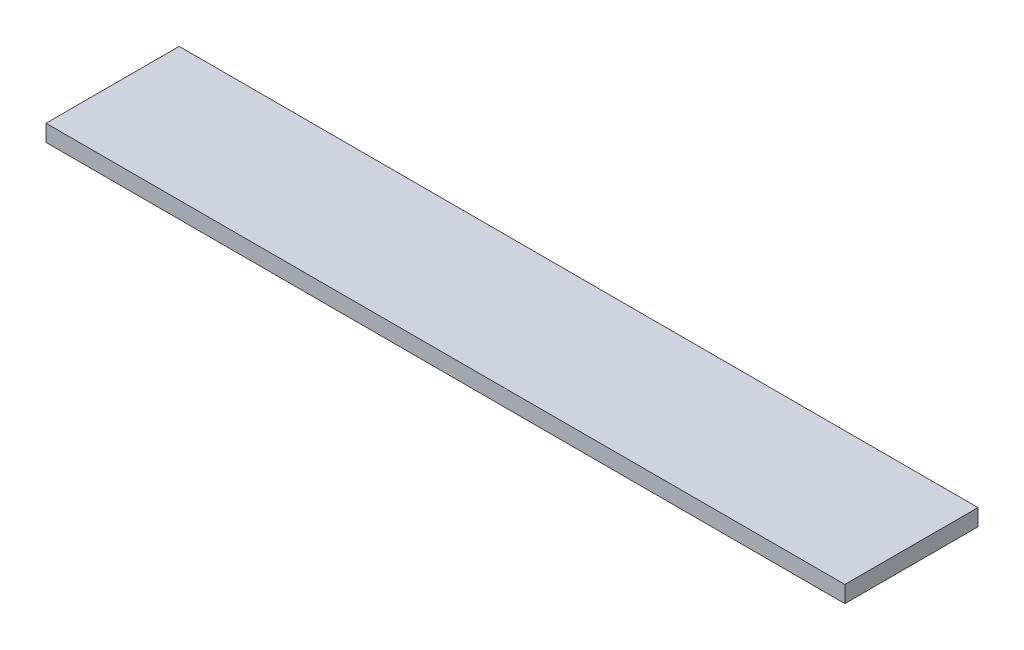
ISO-10303-21;
HEADER;
FILE_DESCRIPTION(('STEP AP214'),'2;1');
FILE_NAME('part.step','',(''),(''),'','','');
FILE_SCHEMA(('AUTOMOTIVE_DESIGN { 1 0 10303 214 1 1 1 1 }'));
ENDSEC;
DATA;
#1=APPLICATION_CONTEXT('core data for automotive mechanical design processes');
#2=APPLICATION_PROTOCOL_DEFINITION('international standard','automotive_design',2000,#1);
#3=PRODUCT_CONTEXT('',#1,'mechanical');
#4=PRODUCT('Part','Part','',(#3));
#5=PRODUCT_RELATED_PRODUCT_CATEGORY('part','',(#4));
#6=PRODUCT_DEFINITION_FORMATION('','',#4);
#7=PRODUCT_DEFINITION_CONTEXT('part definition',#1,'design');
#8=PRODUCT_DEFINITION('design','',#6,#7);
#9=PRODUCT_DEFINITION_SHAPE('','',#8);
#10=(LENGTH_UNIT() NAMED_UNIT(*) SI_UNIT(.MILLI.,.METRE.));
#11=(NAMED_UNIT(*) PLANE_ANGLE_UNIT() SI_UNIT($,.RADIAN.));
#12=(NAMED_UNIT(*) SI_UNIT($,.STERADIAN.) SOLID_ANGLE_UNIT());
#13=UNCERTAINTY_MEASURE_WITH_UNIT(LENGTH_MEASURE(1.E-05),#10,'distance_accuracy_value','');
#14=(GEOMETRIC_REPRESENTATION_CONTEXT(3) GLOBAL_UNCERTAINTY_ASSIGNED_CONTEXT((#13)) GLOBAL_UNIT_ASSIGNED_CONTEXT((#10,
#11,#12)) REPRESENTATION_CONTEXT('',''));
#15=CARTESIAN_POINT('',(0.,0.,0.));
#16=DIRECTION('',(0.,0.,1.));
#17=DIRECTION('',(1.,0.,0.));
#18=AXIS2_PLACEMENT_3D('',#15,#16,#17);
#19=CARTESIAN_POINT('',(38.1,1.5875,6.35));
#20=DIRECTION('',(-1.,0.,0.));
#21=DIRECTION('',(0.,0.,1.));
#22=AXIS2_PLACEMENT_3D('',#19,#20,#21);
#23=PLANE('',#22);
#24=DIRECTION('',(0.,0.,-1.));
#25=VECTOR('',#24,1.);
#26=CARTESIAN_POINT('',(38.1,0.,6.35));
#27=LINE('',#26,#25);
#28=CARTESIAN_POINT('',(38.1,0.,6.35));
#29=VERTEX_POINT('',#28);
#30=CARTESIAN_POINT('',(38.1,0.,-6.35));
#31=VERTEX_POINT('',#30);
#32=EDGE_CURVE('E100',#29,#31,#27,.T.);
#33=ORIENTED_EDGE('',*,*,#32,.T.);
#34=DIRECTION('',(0.,-1.,0.));
#35=VECTOR('',#34,1.);
#36=CARTESIAN_POINT('',(38.1,1.5875,-6.35));
#37=LINE('',#36,#35);
#38=CARTESIAN_POINT('',(38.1,1.5875,-6.35));
#39=VERTEX_POINT('',#38);
#40=EDGE_CURVE('E11',#39,#31,#37,.T.);
#41=ORIENTED_EDGE('',*,*,#40,.F.);
#42=DIRECTION('',(0.,0.,-1.));
#43=VECTOR('',#42,1.);
#44=CARTESIAN_POINT('',(38.1,1.5875,6.35));
#45=LINE('',#44,#43);
#46=CARTESIAN_POINT('',(38.1,1.5875,6.35));
#47=VERTEX_POINT('',#46);
#48=EDGE_CURVE('E88',#47,#39,#45,.T.);
#49=ORIENTED_EDGE('',*,*,#48,.F.);
#50=DIRECTION('',(0.,-1.,0.));
#51=VECTOR('',#50,1.);
#52=CARTESIAN_POINT('',(38.1,1.5875,6.35));
#53=LINE('',#52,#51);
#54=EDGE_CURVE('E96',#47,#29,#53,.T.);
#55=ORIENTED_EDGE('',*,*,#54,.T.);
#56=EDGE_LOOP('',(#33,#41,#49,#55));
#57=FACE_BOUND('',#56,.T.);
#58=ADVANCED_FACE('F37',(#57),#23,.F.);
#59=CARTESIAN_POINT('',(-38.1,1.5875,-6.35));
#60=DIRECTION('',(0.,0.,1.));
#61=DIRECTION('',(1.,0.,0.));
#62=AXIS2_PLACEMENT_3D('',#59,#60,#61);
#63=PLANE('',#62);
#64=DIRECTION('',(-1.,0.,0.));
#65=VECTOR('',#64,1.);
#66=CARTESIAN_POINT('',(-38.1,0.,-6.35));
#67=LINE('',#66,#65);
#68=CARTESIAN_POINT('',(-38.1,0.,-6.35));
#69=VERTEX_POINT('',#68);
#70=EDGE_CURVE('E92',#31,#69,#67,.T.);
#71=ORIENTED_EDGE('',*,*,#70,.T.);
#72=DIRECTION('',(0.,-1.,0.));
#73=VECTOR('',#72,1.);
#74=CARTESIAN_POINT('',(-38.1,1.5875,-6.35));
#75=LINE('',#74,#73);
#76=CARTESIAN_POINT('',(-38.1,1.5875,-6.35));
#77=VERTEX_POINT('',#76);
#78=EDGE_CURVE('E45',#77,#69,#75,.T.);
#79=ORIENTED_EDGE('',*,*,#78,.F.);
#80=DIRECTION('',(-1.,0.,0.));
#81=VECTOR('',#80,1.);
#82=CARTESIAN_POINT('',(-38.1,1.5875,-6.35));
#83=LINE('',#82,#81);
#84=EDGE_CURVE('E83',#39,#77,#83,.T.);
#85=ORIENTED_EDGE('',*,*,#84,.F.);
#86=ORIENTED_EDGE('',*,*,#40,.T.);
#87=EDGE_LOOP('',(#71,#79,#85,#86));
#88=FACE_BOUND('',#87,.T.);
#89=ADVANCED_FACE('F91',(#88),#63,.F.);
#90=CARTESIAN_POINT('',(-38.1,1.5875,6.35));
#91=DIRECTION('',(1.,0.,0.));
#92=DIRECTION('',(0.,0.,-1.));
#93=AXIS2_PLACEMENT_3D('',#90,#91,#92);
#94=PLANE('',#93);
#95=DIRECTION('',(0.,0.,1.));
#96=VECTOR('',#95,1.);
#97=CARTESIAN_POINT('',(-38.1,0.,6.35));
#98=LINE('',#97,#96);
#99=CARTESIAN_POINT('',(-38.1,0.,6.35));
#100=VERTEX_POINT('',#99);
#101=EDGE_CURVE('E70',#69,#100,#98,.T.);
#102=ORIENTED_EDGE('',*,*,#101,.T.);
#103=DIRECTION('',(0.,-1.,0.));
#104=VECTOR('',#103,1.);
#105=CARTESIAN_POINT('',(-38.1,1.5875,6.35));
#106=LINE('',#105,#104);
#107=CARTESIAN_POINT('',(-38.1,1.5875,6.35));
#108=VERTEX_POINT('',#107);
#109=EDGE_CURVE('E93',#108,#100,#106,.T.);
#110=ORIENTED_EDGE('',*,*,#109,.F.);
#111=DIRECTION('',(0.,0.,1.));
#112=VECTOR('',#111,1.);
#113=CARTESIAN_POINT('',(-38.1,1.5875,6.35));
#114=LINE('',#113,#112);
#115=EDGE_CURVE('E86',#77,#108,#114,.T.);
#116=ORIENTED_EDGE('',*,*,#115,.F.);
#117=ORIENTED_EDGE('',*,*,#78,.T.);
#118=EDGE_LOOP('',(#102,#110,#116,#117));
#119=FACE_BOUND('',#118,.T.);
#120=ADVANCED_FACE('F94',(#119),#94,.F.);
#121=CARTESIAN_POINT('',(-38.1,1.5875,6.35));
#122=DIRECTION('',(0.,0.,-1.));
#123=DIRECTION('',(-1.,0.,0.));
#124=AXIS2_PLACEMENT_3D('',#121,#122,#123);
#125=PLANE('',#124);
#126=DIRECTION('',(1.,0.,0.));
#127=VECTOR('',#126,1.);
#128=CARTESIAN_POINT('',(-38.1,0.,6.35));
#129=LINE('',#128,#127);
#130=EDGE_CURVE('E76',#100,#29,#129,.T.);
#131=ORIENTED_EDGE('',*,*,#130,.T.);
#132=ORIENTED_EDGE('',*,*,#54,.F.);
#133=DIRECTION('',(1.,0.,0.));
#134=VECTOR('',#133,1.);
#135=CARTESIAN_POINT('',(-38.1,1.5875,6.35));
#136=LINE('',#135,#134);
#137=EDGE_CURVE('E53',#108,#47,#136,.T.);
#138=ORIENTED_EDGE('',*,*,#137,.F.);
#139=ORIENTED_EDGE('',*,*,#109,.T.);
#140=EDGE_LOOP('',(#131,#132,#138,#139));
#141=FACE_BOUND('',#140,.T.);
#142=ADVANCED_FACE('F107',(#141),#125,.F.);
#143=CARTESIAN_POINT('',(0.,1.5875,0.));
#144=DIRECTION('',(0.,-1.,0.));
#145=DIRECTION('',(0.,0.,-1.));
#146=AXIS2_PLACEMENT_3D('',#143,#144,#145);
#147=PLANE('',#146);
#148=ORIENTED_EDGE('',*,*,#48,.T.);
#149=ORIENTED_EDGE('',*,*,#84,.T.);
#150=ORIENTED_EDGE('',*,*,#115,.T.);
#151=ORIENTED_EDGE('',*,*,#137,.T.);
#152=EDGE_LOOP('',(#148,#149,#150,#151));
#153=FACE_BOUND('',#152,.T.);
#154=ADVANCED_FACE('F84',(#153),#147,.F.);
#155=CARTESIAN_POINT('',(0.,0.,0.));
#156=DIRECTION('',(0.,-1.,0.));
#157=DIRECTION('',(0.,0.,-1.));
#158=AXIS2_PLACEMENT_3D('',#155,#156,#157);
#159=PLANE('',#158);
#160=ORIENTED_EDGE('',*,*,#32,.F.);
#161=ORIENTED_EDGE('',*,*,#130,.F.);
#162=ORIENTED_EDGE('',*,*,#101,.F.);
#163=ORIENTED_EDGE('',*,*,#70,.F.);
#164=EDGE_LOOP('',(#160,#161,#162,#163));
#165=FACE_BOUND('',#164,.T.);
#166=ADVANCED_FACE('F110',(#165),#159,.T.);
#167=CLOSED_SHELL('',(#58,#89,#120,#142,#154,#166));
#168=MANIFOLD_SOLID_BREP('B2',#167);
#169=ADVANCED_BREP_SHAPE_REPRESENTATION('',(#18,#168),#14);
#170=SHAPE_DEFINITION_REPRESENTATION(#9,#169);
ENDSEC;
END-ISO-10303-21;
